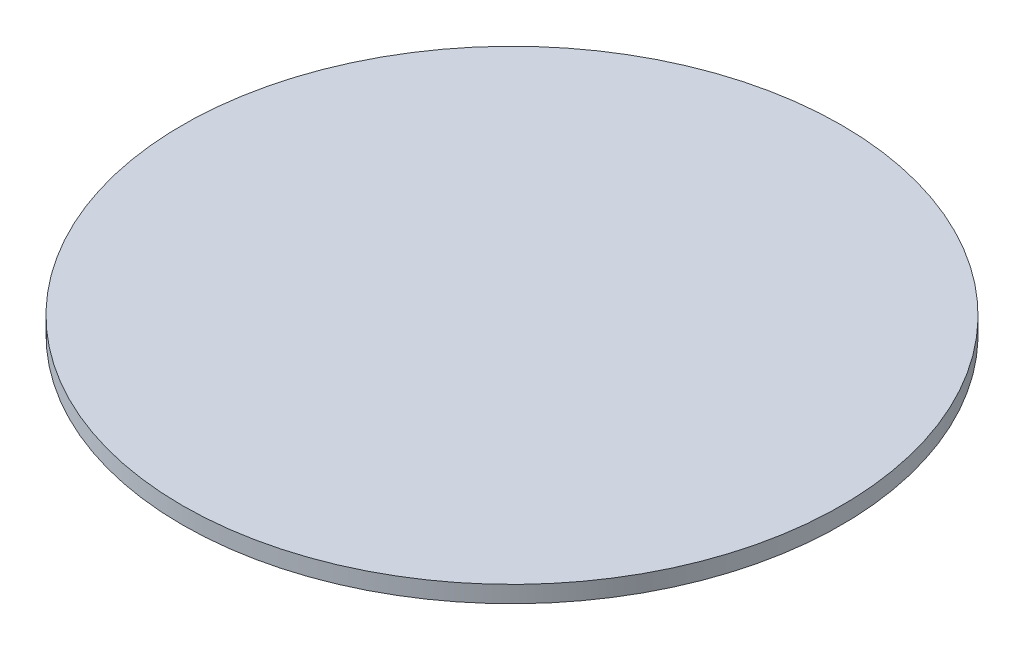
ISO-10303-21;
HEADER;
FILE_DESCRIPTION(('STEP AP214'),'2;1');
FILE_NAME('part.step','',(''),(''),'','','');
FILE_SCHEMA(('AUTOMOTIVE_DESIGN { 1 0 10303 214 1 1 1 1 }'));
ENDSEC;
DATA;
#1=APPLICATION_CONTEXT('core data for automotive mechanical design processes');
#2=APPLICATION_PROTOCOL_DEFINITION('international standard','automotive_design',2000,#1);
#3=PRODUCT_CONTEXT('',#1,'mechanical');
#4=PRODUCT('Part','Part','',(#3));
#5=PRODUCT_RELATED_PRODUCT_CATEGORY('part','',(#4));
#6=PRODUCT_DEFINITION_FORMATION('','',#4);
#7=PRODUCT_DEFINITION_CONTEXT('part definition',#1,'design');
#8=PRODUCT_DEFINITION('design','',#6,#7);
#9=PRODUCT_DEFINITION_SHAPE('','',#8);
#10=(LENGTH_UNIT() NAMED_UNIT(*) SI_UNIT(.MILLI.,.METRE.));
#11=(NAMED_UNIT(*) PLANE_ANGLE_UNIT() SI_UNIT($,.RADIAN.));
#12=(NAMED_UNIT(*) SI_UNIT($,.STERADIAN.) SOLID_ANGLE_UNIT());
#13=UNCERTAINTY_MEASURE_WITH_UNIT(LENGTH_MEASURE(1.E-05),#10,'distance_accuracy_value','');
#14=(GEOMETRIC_REPRESENTATION_CONTEXT(3) GLOBAL_UNCERTAINTY_ASSIGNED_CONTEXT((#13)) GLOBAL_UNIT_ASSIGNED_CONTEXT((#10,
#11,#12)) REPRESENTATION_CONTEXT('',''));
#15=CARTESIAN_POINT('',(0.,0.,0.));
#16=DIRECTION('',(0.,0.,1.));
#17=DIRECTION('',(1.,0.,0.));
#18=AXIS2_PLACEMENT_3D('',#15,#16,#17);
#19=CARTESIAN_POINT('',(0.,3.,0.));
#20=DIRECTION('',(0.,-1.,0.));
#21=DIRECTION('',(0.,0.,-1.));
#22=AXIS2_PLACEMENT_3D('',#19,#20,#21);
#23=CYLINDRICAL_SURFACE('',#22,59.);
#24=CARTESIAN_POINT('',(0.,3.,0.));
#25=DIRECTION('',(0.,1.,0.));
#26=DIRECTION('',(0.,0.,1.));
#27=AXIS2_PLACEMENT_3D('',#24,#25,#26);
#28=CIRCLE('',#27,59.);
#29=CARTESIAN_POINT('',(0.,3.,59.));
#30=VERTEX_POINT('',#29);
#31=EDGE_CURVE('E10',#30,#30,#28,.T.);
#32=ORIENTED_EDGE('',*,*,#31,.F.);
#33=EDGE_LOOP('',(#32));
#34=FACE_BOUND('',#33,.T.);
#35=CARTESIAN_POINT('',(0.,0.,0.));
#36=DIRECTION('',(0.,1.,0.));
#37=DIRECTION('',(0.,0.,1.));
#38=AXIS2_PLACEMENT_3D('',#35,#36,#37);
#39=CIRCLE('',#38,59.);
#40=CARTESIAN_POINT('',(0.,0.,59.));
#41=VERTEX_POINT('',#40);
#42=EDGE_CURVE('E35',#41,#41,#39,.T.);
#43=ORIENTED_EDGE('',*,*,#42,.T.);
#44=EDGE_LOOP('',(#43));
#45=FACE_BOUND('',#44,.T.);
#46=ADVANCED_FACE('F32',(#34,#45),#23,.T.);
#47=CARTESIAN_POINT('',(0.,3.,0.));
#48=DIRECTION('',(0.,1.,0.));
#49=DIRECTION('',(0.,0.,1.));
#50=AXIS2_PLACEMENT_3D('',#47,#48,#49);
#51=PLANE('',#50);
#52=ORIENTED_EDGE('',*,*,#31,.T.);
#53=EDGE_LOOP('',(#52));
#54=FACE_BOUND('',#53,.T.);
#55=ADVANCED_FACE('F47',(#54),#51,.T.);
#56=CARTESIAN_POINT('',(0.,0.,0.));
#57=DIRECTION('',(0.,1.,0.));
#58=DIRECTION('',(0.,0.,1.));
#59=AXIS2_PLACEMENT_3D('',#56,#57,#58);
#60=PLANE('',#59);
#61=ORIENTED_EDGE('',*,*,#42,.F.);
#62=EDGE_LOOP('',(#61));
#63=FACE_BOUND('',#62,.T.);
#64=ADVANCED_FACE('F45',(#63),#60,.F.);
#65=CLOSED_SHELL('',(#46,#55,#64));
#66=MANIFOLD_SOLID_BREP('B2',#65);
#67=ADVANCED_BREP_SHAPE_REPRESENTATION('',(#18,#66),#14);
#68=SHAPE_DEFINITION_REPRESENTATION(#9,#67);
ENDSEC;
END-ISO-10303-21;
